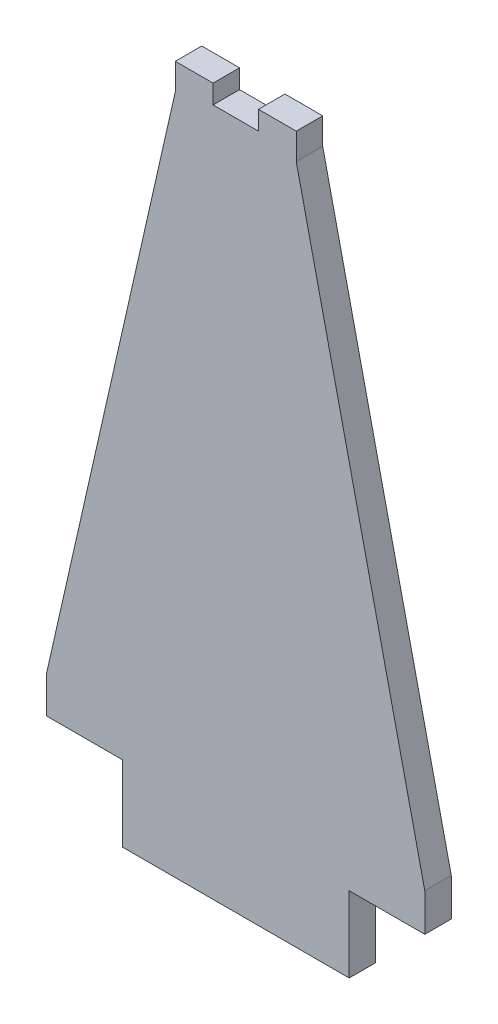
ISO-10303-21;
HEADER;
FILE_DESCRIPTION(('STEP AP214'),'2;1');
FILE_NAME('part.step','',(''),(''),'','','');
FILE_SCHEMA(('AUTOMOTIVE_DESIGN { 1 0 10303 214 1 1 1 1 }'));
ENDSEC;
DATA;
#1=APPLICATION_CONTEXT('core data for automotive mechanical design processes');
#2=APPLICATION_PROTOCOL_DEFINITION('international standard','automotive_design',2000,#1);
#3=PRODUCT_CONTEXT('',#1,'mechanical');
#4=PRODUCT('Part','Part','',(#3));
#5=PRODUCT_RELATED_PRODUCT_CATEGORY('part','',(#4));
#6=PRODUCT_DEFINITION_FORMATION('','',#4);
#7=PRODUCT_DEFINITION_CONTEXT('part definition',#1,'design');
#8=PRODUCT_DEFINITION('design','',#6,#7);
#9=PRODUCT_DEFINITION_SHAPE('','',#8);
#10=(LENGTH_UNIT() NAMED_UNIT(*) SI_UNIT(.MILLI.,.METRE.));
#11=(NAMED_UNIT(*) PLANE_ANGLE_UNIT() SI_UNIT($,.RADIAN.));
#12=(NAMED_UNIT(*) SI_UNIT($,.STERADIAN.) SOLID_ANGLE_UNIT());
#13=UNCERTAINTY_MEASURE_WITH_UNIT(LENGTH_MEASURE(1.E-05),#10,'distance_accuracy_value','');
#14=(GEOMETRIC_REPRESENTATION_CONTEXT(3) GLOBAL_UNCERTAINTY_ASSIGNED_CONTEXT((#13)) GLOBAL_UNIT_ASSIGNED_CONTEXT((#10,
#11,#12)) REPRESENTATION_CONTEXT('',''));
#15=CARTESIAN_POINT('',(0.,0.,0.));
#16=DIRECTION('',(0.,0.,1.));
#17=DIRECTION('',(1.,0.,0.));
#18=AXIS2_PLACEMENT_3D('',#15,#16,#17);
#19=CARTESIAN_POINT('',(0.,1.,0.175));
#20=DIRECTION('',(1.,0.,0.));
#21=DIRECTION('',(0.,1.,0.));
#22=AXIS2_PLACEMENT_3D('',#19,#20,#21);
#23=PLANE('',#22);
#24=DIRECTION('',(0.,-1.,0.));
#25=VECTOR('',#24,1.);
#26=CARTESIAN_POINT('',(0.,1.,-0.175));
#27=LINE('',#26,#25);
#28=CARTESIAN_POINT('',(0.,1.,-0.175));
#29=VERTEX_POINT('',#28);
#30=CARTESIAN_POINT('',(0.,0.,-0.175));
#31=VERTEX_POINT('',#30);
#32=EDGE_CURVE('E177',#29,#31,#27,.T.);
#33=ORIENTED_EDGE('',*,*,#32,.T.);
#34=DIRECTION('',(0.,0.,-1.));
#35=VECTOR('',#34,1.);
#36=CARTESIAN_POINT('',(0.,0.,0.175));
#37=LINE('',#36,#35);
#38=CARTESIAN_POINT('',(0.,0.,0.175));
#39=VERTEX_POINT('',#38);
#40=EDGE_CURVE('E11',#39,#31,#37,.T.);
#41=ORIENTED_EDGE('',*,*,#40,.F.);
#42=DIRECTION('',(0.,-1.,0.));
#43=VECTOR('',#42,1.);
#44=CARTESIAN_POINT('',(0.,1.,0.175));
#45=LINE('',#44,#43);
#46=CARTESIAN_POINT('',(0.,1.,0.175));
#47=VERTEX_POINT('',#46);
#48=EDGE_CURVE('E207',#47,#39,#45,.T.);
#49=ORIENTED_EDGE('',*,*,#48,.F.);
#50=DIRECTION('',(0.,0.,-1.));
#51=VECTOR('',#50,1.);
#52=CARTESIAN_POINT('',(0.,1.,0.175));
#53=LINE('',#52,#51);
#54=EDGE_CURVE('E173',#47,#29,#53,.T.);
#55=ORIENTED_EDGE('',*,*,#54,.T.);
#56=EDGE_LOOP('',(#33,#41,#49,#55));
#57=FACE_BOUND('',#56,.T.);
#58=ADVANCED_FACE('F33',(#57),#23,.F.);
#59=CARTESIAN_POINT('',(0.,0.,0.175));
#60=DIRECTION('',(0.,1.,0.));
#61=DIRECTION('',(-1.,0.,0.));
#62=AXIS2_PLACEMENT_3D('',#59,#60,#61);
#63=PLANE('',#62);
#64=DIRECTION('',(1.,0.,0.));
#65=VECTOR('',#64,1.);
#66=CARTESIAN_POINT('',(0.,0.,-0.175));
#67=LINE('',#66,#65);
#68=CARTESIAN_POINT('',(3.,0.,-0.175));
#69=VERTEX_POINT('',#68);
#70=EDGE_CURVE('E180',#31,#69,#67,.T.);
#71=ORIENTED_EDGE('',*,*,#70,.T.);
#72=DIRECTION('',(0.,0.,-1.));
#73=VECTOR('',#72,1.);
#74=CARTESIAN_POINT('',(3.,0.,0.175));
#75=LINE('',#74,#73);
#76=CARTESIAN_POINT('',(3.,0.,0.175));
#77=VERTEX_POINT('',#76);
#78=EDGE_CURVE('E41',#77,#69,#75,.T.);
#79=ORIENTED_EDGE('',*,*,#78,.F.);
#80=DIRECTION('',(1.,0.,0.));
#81=VECTOR('',#80,1.);
#82=CARTESIAN_POINT('',(0.,0.,0.175));
#83=LINE('',#82,#81);
#84=EDGE_CURVE('E116',#39,#77,#83,.T.);
#85=ORIENTED_EDGE('',*,*,#84,.F.);
#86=ORIENTED_EDGE('',*,*,#40,.T.);
#87=EDGE_LOOP('',(#71,#79,#85,#86));
#88=FACE_BOUND('',#87,.T.);
#89=ADVANCED_FACE('F305',(#88),#63,.F.);
#90=CARTESIAN_POINT('',(3.,0.,0.175));
#91=DIRECTION('',(-1.,0.,0.));
#92=DIRECTION('',(0.,0.,1.));
#93=AXIS2_PLACEMENT_3D('',#90,#91,#92);
#94=PLANE('',#93);
#95=DIRECTION('',(0.,1.,0.));
#96=VECTOR('',#95,1.);
#97=CARTESIAN_POINT('',(3.,0.,-0.175));
#98=LINE('',#97,#96);
#99=CARTESIAN_POINT('',(3.,1.,-0.175));
#100=VERTEX_POINT('',#99);
#101=EDGE_CURVE('E182',#69,#100,#98,.T.);
#102=ORIENTED_EDGE('',*,*,#101,.T.);
#103=DIRECTION('',(0.,0.,-1.));
#104=VECTOR('',#103,1.);
#105=CARTESIAN_POINT('',(3.,1.,0.175));
#106=LINE('',#105,#104);
#107=CARTESIAN_POINT('',(3.,1.,0.175));
#108=VERTEX_POINT('',#107);
#109=EDGE_CURVE('E238',#108,#100,#106,.T.);
#110=ORIENTED_EDGE('',*,*,#109,.F.);
#111=DIRECTION('',(0.,1.,0.));
#112=VECTOR('',#111,1.);
#113=CARTESIAN_POINT('',(3.,0.,0.175));
#114=LINE('',#113,#112);
#115=EDGE_CURVE('E246',#77,#108,#114,.T.);
#116=ORIENTED_EDGE('',*,*,#115,.F.);
#117=ORIENTED_EDGE('',*,*,#78,.T.);
#118=EDGE_LOOP('',(#102,#110,#116,#117));
#119=FACE_BOUND('',#118,.T.);
#120=ADVANCED_FACE('F244',(#119),#94,.F.);
#121=CARTESIAN_POINT('',(3.,1.,0.175));
#122=DIRECTION('',(0.,1.,0.));
#123=DIRECTION('',(-1.,0.,0.));
#124=AXIS2_PLACEMENT_3D('',#121,#122,#123);
#125=PLANE('',#124);
#126=DIRECTION('',(1.,0.,0.));
#127=VECTOR('',#126,1.);
#128=CARTESIAN_POINT('',(3.,1.,-0.175));
#129=LINE('',#128,#127);
#130=CARTESIAN_POINT('',(4.,1.,-0.175));
#131=VERTEX_POINT('',#130);
#132=EDGE_CURVE('E184',#100,#131,#129,.T.);
#133=ORIENTED_EDGE('',*,*,#132,.T.);
#134=DIRECTION('',(0.,0.,-1.));
#135=VECTOR('',#134,1.);
#136=CARTESIAN_POINT('',(4.,1.,0.175));
#137=LINE('',#136,#135);
#138=CARTESIAN_POINT('',(4.,1.,0.175));
#139=VERTEX_POINT('',#138);
#140=EDGE_CURVE('E235',#139,#131,#137,.T.);
#141=ORIENTED_EDGE('',*,*,#140,.F.);
#142=DIRECTION('',(1.,0.,0.));
#143=VECTOR('',#142,1.);
#144=CARTESIAN_POINT('',(3.,1.,0.175));
#145=LINE('',#144,#143);
#146=EDGE_CURVE('E264',#108,#139,#145,.T.);
#147=ORIENTED_EDGE('',*,*,#146,.F.);
#148=ORIENTED_EDGE('',*,*,#109,.T.);
#149=EDGE_LOOP('',(#133,#141,#147,#148));
#150=FACE_BOUND('',#149,.T.);
#151=ADVANCED_FACE('F255',(#150),#125,.F.);
#152=CARTESIAN_POINT('',(4.,1.,0.175));
#153=DIRECTION('',(-1.,0.,0.));
#154=DIRECTION('',(0.,0.,1.));
#155=AXIS2_PLACEMENT_3D('',#152,#153,#154);
#156=PLANE('',#155);
#157=DIRECTION('',(0.,1.,0.));
#158=VECTOR('',#157,1.);
#159=CARTESIAN_POINT('',(4.,1.,-0.175));
#160=LINE('',#159,#158);
#161=CARTESIAN_POINT('',(4.,1.5,-0.175));
#162=VERTEX_POINT('',#161);
#163=EDGE_CURVE('E186',#131,#162,#160,.T.);
#164=ORIENTED_EDGE('',*,*,#163,.T.);
#165=DIRECTION('',(0.,0.,-1.));
#166=VECTOR('',#165,1.);
#167=CARTESIAN_POINT('',(4.,1.5,0.175));
#168=LINE('',#167,#166);
#169=CARTESIAN_POINT('',(4.,1.5,0.175));
#170=VERTEX_POINT('',#169);
#171=EDGE_CURVE('E232',#170,#162,#168,.T.);
#172=ORIENTED_EDGE('',*,*,#171,.F.);
#173=DIRECTION('',(0.,1.,0.));
#174=VECTOR('',#173,1.);
#175=CARTESIAN_POINT('',(4.,1.,0.175));
#176=LINE('',#175,#174);
#177=EDGE_CURVE('E261',#139,#170,#176,.T.);
#178=ORIENTED_EDGE('',*,*,#177,.F.);
#179=ORIENTED_EDGE('',*,*,#140,.T.);
#180=EDGE_LOOP('',(#164,#172,#178,#179));
#181=FACE_BOUND('',#180,.T.);
#182=ADVANCED_FACE('F259',(#181),#156,.F.);
#183=CARTESIAN_POINT('',(4.,1.5,0.175));
#184=DIRECTION('',(-0.97526042930658,-0.221059030642825,0.));
#185=DIRECTION('',(0.221059030642825,-0.97526042930658,0.));
#186=AXIS2_PLACEMENT_3D('',#183,#184,#185);
#187=PLANE('',#186);
#188=DIRECTION('',(-0.221059030642825,0.97526042930658,0.));
#189=VECTOR('',#188,1.);
#190=CARTESIAN_POINT('',(4.,1.5,-0.175));
#191=LINE('',#190,#189);
#192=CARTESIAN_POINT('',(2.3,9.,-0.175));
#193=VERTEX_POINT('',#192);
#194=EDGE_CURVE('E188',#162,#193,#191,.T.);
#195=ORIENTED_EDGE('',*,*,#194,.T.);
#196=DIRECTION('',(0.,0.,-1.));
#197=VECTOR('',#196,1.);
#198=CARTESIAN_POINT('',(2.3,9.,0.175));
#199=LINE('',#198,#197);
#200=CARTESIAN_POINT('',(2.3,9.,0.175));
#201=VERTEX_POINT('',#200);
#202=EDGE_CURVE('E229',#201,#193,#199,.T.);
#203=ORIENTED_EDGE('',*,*,#202,.F.);
#204=DIRECTION('',(-0.221059030642825,0.97526042930658,0.));
#205=VECTOR('',#204,1.);
#206=CARTESIAN_POINT('',(4.,1.5,0.175));
#207=LINE('',#206,#205);
#208=EDGE_CURVE('E263',#170,#201,#207,.T.);
#209=ORIENTED_EDGE('',*,*,#208,.F.);
#210=ORIENTED_EDGE('',*,*,#171,.T.);
#211=EDGE_LOOP('',(#195,#203,#209,#210));
#212=FACE_BOUND('',#211,.T.);
#213=ADVANCED_FACE('F318',(#212),#187,.F.);
#214=CARTESIAN_POINT('',(2.3,9.,0.175));
#215=DIRECTION('',(-1.,0.,0.));
#216=DIRECTION('',(0.,0.,1.));
#217=AXIS2_PLACEMENT_3D('',#214,#215,#216);
#218=PLANE('',#217);
#219=DIRECTION('',(0.,1.,0.));
#220=VECTOR('',#219,1.);
#221=CARTESIAN_POINT('',(2.3,9.,-0.175));
#222=LINE('',#221,#220);
#223=CARTESIAN_POINT('',(2.3,9.35,-0.175));
#224=VERTEX_POINT('',#223);
#225=EDGE_CURVE('E190',#193,#224,#222,.T.);
#226=ORIENTED_EDGE('',*,*,#225,.T.);
#227=DIRECTION('',(0.,0.,-1.));
#228=VECTOR('',#227,1.);
#229=CARTESIAN_POINT('',(2.3,9.35,0.175));
#230=LINE('',#229,#228);
#231=CARTESIAN_POINT('',(2.3,9.35,0.175));
#232=VERTEX_POINT('',#231);
#233=EDGE_CURVE('E226',#232,#224,#230,.T.);
#234=ORIENTED_EDGE('',*,*,#233,.F.);
#235=DIRECTION('',(0.,1.,0.));
#236=VECTOR('',#235,1.);
#237=CARTESIAN_POINT('',(2.3,9.,0.175));
#238=LINE('',#237,#236);
#239=EDGE_CURVE('E266',#201,#232,#238,.T.);
#240=ORIENTED_EDGE('',*,*,#239,.F.);
#241=ORIENTED_EDGE('',*,*,#202,.T.);
#242=EDGE_LOOP('',(#226,#234,#240,#241));
#243=FACE_BOUND('',#242,.T.);
#244=ADVANCED_FACE('F321',(#243),#218,.F.);
#245=CARTESIAN_POINT('',(2.3,9.35,0.175));
#246=DIRECTION('',(0.,-1.,0.));
#247=DIRECTION('',(0.,0.,-1.));
#248=AXIS2_PLACEMENT_3D('',#245,#246,#247);
#249=PLANE('',#248);
#250=DIRECTION('',(-1.,0.,0.));
#251=VECTOR('',#250,1.);
#252=CARTESIAN_POINT('',(2.3,9.35,-0.175));
#253=LINE('',#252,#251);
#254=CARTESIAN_POINT('',(1.8,9.35,-0.175));
#255=VERTEX_POINT('',#254);
#256=EDGE_CURVE('E192',#224,#255,#253,.T.);
#257=ORIENTED_EDGE('',*,*,#256,.T.);
#258=DIRECTION('',(0.,0.,-1.));
#259=VECTOR('',#258,1.);
#260=CARTESIAN_POINT('',(1.8,9.35,0.175));
#261=LINE('',#260,#259);
#262=CARTESIAN_POINT('',(1.8,9.35,0.175));
#263=VERTEX_POINT('',#262);
#264=EDGE_CURVE('E223',#263,#255,#261,.T.);
#265=ORIENTED_EDGE('',*,*,#264,.F.);
#266=DIRECTION('',(-1.,0.,0.));
#267=VECTOR('',#266,1.);
#268=CARTESIAN_POINT('',(2.3,9.35,0.175));
#269=LINE('',#268,#267);
#270=EDGE_CURVE('E272',#232,#263,#269,.T.);
#271=ORIENTED_EDGE('',*,*,#270,.F.);
#272=ORIENTED_EDGE('',*,*,#233,.T.);
#273=EDGE_LOOP('',(#257,#265,#271,#272));
#274=FACE_BOUND('',#273,.T.);
#275=ADVANCED_FACE('F325',(#274),#249,.F.);
#276=CARTESIAN_POINT('',(1.8,9.35,0.175));
#277=DIRECTION('',(1.,0.,0.));
#278=DIRECTION('',(0.,1.,0.));
#279=AXIS2_PLACEMENT_3D('',#276,#277,#278);
#280=PLANE('',#279);
#281=DIRECTION('',(0.,-1.,0.));
#282=VECTOR('',#281,1.);
#283=CARTESIAN_POINT('',(1.8,9.35,-0.175));
#284=LINE('',#283,#282);
#285=CARTESIAN_POINT('',(1.8,9.1,-0.175));
#286=VERTEX_POINT('',#285);
#287=EDGE_CURVE('E194',#255,#286,#284,.T.);
#288=ORIENTED_EDGE('',*,*,#287,.T.);
#289=DIRECTION('',(0.,0.,-1.));
#290=VECTOR('',#289,1.);
#291=CARTESIAN_POINT('',(1.8,9.1,0.175));
#292=LINE('',#291,#290);
#293=CARTESIAN_POINT('',(1.8,9.1,0.175));
#294=VERTEX_POINT('',#293);
#295=EDGE_CURVE('E220',#294,#286,#292,.T.);
#296=ORIENTED_EDGE('',*,*,#295,.F.);
#297=DIRECTION('',(0.,-1.,0.));
#298=VECTOR('',#297,1.);
#299=CARTESIAN_POINT('',(1.8,9.35,0.175));
#300=LINE('',#299,#298);
#301=EDGE_CURVE('E274',#263,#294,#300,.T.);
#302=ORIENTED_EDGE('',*,*,#301,.F.);
#303=ORIENTED_EDGE('',*,*,#264,.T.);
#304=EDGE_LOOP('',(#288,#296,#302,#303));
#305=FACE_BOUND('',#304,.T.);
#306=ADVANCED_FACE('F329',(#305),#280,.F.);
#307=CARTESIAN_POINT('',(1.8,9.1,0.175));
#308=DIRECTION('',(0.,-1.,0.));
#309=DIRECTION('',(0.,0.,-1.));
#310=AXIS2_PLACEMENT_3D('',#307,#308,#309);
#311=PLANE('',#310);
#312=DIRECTION('',(-1.,0.,0.));
#313=VECTOR('',#312,1.);
#314=CARTESIAN_POINT('',(1.8,9.1,-0.175));
#315=LINE('',#314,#313);
#316=CARTESIAN_POINT('',(1.2,9.1,-0.175));
#317=VERTEX_POINT('',#316);
#318=EDGE_CURVE('E196',#286,#317,#315,.T.);
#319=ORIENTED_EDGE('',*,*,#318,.T.);
#320=DIRECTION('',(0.,0.,-1.));
#321=VECTOR('',#320,1.);
#322=CARTESIAN_POINT('',(1.2,9.1,0.175));
#323=LINE('',#322,#321);
#324=CARTESIAN_POINT('',(1.2,9.1,0.175));
#325=VERTEX_POINT('',#324);
#326=EDGE_CURVE('E217',#325,#317,#323,.T.);
#327=ORIENTED_EDGE('',*,*,#326,.F.);
#328=DIRECTION('',(-1.,0.,0.));
#329=VECTOR('',#328,1.);
#330=CARTESIAN_POINT('',(1.8,9.1,0.175));
#331=LINE('',#330,#329);
#332=EDGE_CURVE('E276',#294,#325,#331,.T.);
#333=ORIENTED_EDGE('',*,*,#332,.F.);
#334=ORIENTED_EDGE('',*,*,#295,.T.);
#335=EDGE_LOOP('',(#319,#327,#333,#334));
#336=FACE_BOUND('',#335,.T.);
#337=ADVANCED_FACE('F333',(#336),#311,.F.);
#338=CARTESIAN_POINT('',(1.2,9.1,0.175));
#339=DIRECTION('',(-1.,0.,0.));
#340=DIRECTION('',(0.,0.,1.));
#341=AXIS2_PLACEMENT_3D('',#338,#339,#340);
#342=PLANE('',#341);
#343=DIRECTION('',(0.,1.,0.));
#344=VECTOR('',#343,1.);
#345=CARTESIAN_POINT('',(1.2,9.1,-0.175));
#346=LINE('',#345,#344);
#347=CARTESIAN_POINT('',(1.2,9.35,-0.175));
#348=VERTEX_POINT('',#347);
#349=EDGE_CURVE('E198',#317,#348,#346,.T.);
#350=ORIENTED_EDGE('',*,*,#349,.T.);
#351=DIRECTION('',(0.,0.,-1.));
#352=VECTOR('',#351,1.);
#353=CARTESIAN_POINT('',(1.2,9.35,0.175));
#354=LINE('',#353,#352);
#355=CARTESIAN_POINT('',(1.2,9.35,0.175));
#356=VERTEX_POINT('',#355);
#357=EDGE_CURVE('E214',#356,#348,#354,.T.);
#358=ORIENTED_EDGE('',*,*,#357,.F.);
#359=DIRECTION('',(0.,1.,0.));
#360=VECTOR('',#359,1.);
#361=CARTESIAN_POINT('',(1.2,9.1,0.175));
#362=LINE('',#361,#360);
#363=EDGE_CURVE('E278',#325,#356,#362,.T.);
#364=ORIENTED_EDGE('',*,*,#363,.F.);
#365=ORIENTED_EDGE('',*,*,#326,.T.);
#366=EDGE_LOOP('',(#350,#358,#364,#365));
#367=FACE_BOUND('',#366,.T.);
#368=ADVANCED_FACE('F337',(#367),#342,.F.);
#369=CARTESIAN_POINT('',(1.2,9.35,0.175));
#370=DIRECTION('',(0.,-1.,0.));
#371=DIRECTION('',(0.,0.,-1.));
#372=AXIS2_PLACEMENT_3D('',#369,#370,#371);
#373=PLANE('',#372);
#374=DIRECTION('',(-1.,0.,0.));
#375=VECTOR('',#374,1.);
#376=CARTESIAN_POINT('',(1.2,9.35,-0.175));
#377=LINE('',#376,#375);
#378=CARTESIAN_POINT('',(0.699999999999999,9.35,-0.175));
#379=VERTEX_POINT('',#378);
#380=EDGE_CURVE('E200',#348,#379,#377,.T.);
#381=ORIENTED_EDGE('',*,*,#380,.T.);
#382=DIRECTION('',(0.,0.,-1.));
#383=VECTOR('',#382,1.);
#384=CARTESIAN_POINT('',(0.699999999999999,9.35,0.175));
#385=LINE('',#384,#383);
#386=CARTESIAN_POINT('',(0.699999999999999,9.35,0.175));
#387=VERTEX_POINT('',#386);
#388=EDGE_CURVE('E211',#387,#379,#385,.T.);
#389=ORIENTED_EDGE('',*,*,#388,.F.);
#390=DIRECTION('',(-1.,0.,0.));
#391=VECTOR('',#390,1.);
#392=CARTESIAN_POINT('',(1.2,9.35,0.175));
#393=LINE('',#392,#391);
#394=EDGE_CURVE('E280',#356,#387,#393,.T.);
#395=ORIENTED_EDGE('',*,*,#394,.F.);
#396=ORIENTED_EDGE('',*,*,#357,.T.);
#397=EDGE_LOOP('',(#381,#389,#395,#396));
#398=FACE_BOUND('',#397,.T.);
#399=ADVANCED_FACE('F286',(#398),#373,.F.);
#400=CARTESIAN_POINT('',(0.699999999999999,9.35,0.175));
#401=DIRECTION('',(1.,0.,0.));
#402=DIRECTION('',(0.,0.,-1.));
#403=AXIS2_PLACEMENT_3D('',#400,#401,#402);
#404=PLANE('',#403);
#405=DIRECTION('',(0.,-1.,0.));
#406=VECTOR('',#405,1.);
#407=CARTESIAN_POINT('',(0.699999999999999,9.35,-0.175));
#408=LINE('',#407,#406);
#409=CARTESIAN_POINT('',(0.699999999999999,9.,-0.175));
#410=VERTEX_POINT('',#409);
#411=EDGE_CURVE('E202',#379,#410,#408,.T.);
#412=ORIENTED_EDGE('',*,*,#411,.T.);
#413=DIRECTION('',(0.,0.,-1.));
#414=VECTOR('',#413,1.);
#415=CARTESIAN_POINT('',(0.699999999999999,9.,0.175));
#416=LINE('',#415,#414);
#417=CARTESIAN_POINT('',(0.699999999999999,9.,0.175));
#418=VERTEX_POINT('',#417);
#419=EDGE_CURVE('E168',#418,#410,#416,.T.);
#420=ORIENTED_EDGE('',*,*,#419,.F.);
#421=DIRECTION('',(0.,-1.,0.));
#422=VECTOR('',#421,1.);
#423=CARTESIAN_POINT('',(0.699999999999999,9.35,0.175));
#424=LINE('',#423,#422);
#425=EDGE_CURVE('E159',#387,#418,#424,.T.);
#426=ORIENTED_EDGE('',*,*,#425,.F.);
#427=ORIENTED_EDGE('',*,*,#388,.T.);
#428=EDGE_LOOP('',(#412,#420,#426,#427));
#429=FACE_BOUND('',#428,.T.);
#430=ADVANCED_FACE('F290',(#429),#404,.F.);
#431=CARTESIAN_POINT('',(0.699999999999999,9.,0.175));
#432=DIRECTION('',(0.97526042930658,-0.221059030642825,0.));
#433=DIRECTION('',(0.221059030642825,0.97526042930658,0.));
#434=AXIS2_PLACEMENT_3D('',#431,#432,#433);
#435=PLANE('',#434);
#436=DIRECTION('',(-0.221059030642825,-0.97526042930658,0.));
#437=VECTOR('',#436,1.);
#438=CARTESIAN_POINT('',(0.699999999999999,9.,-0.175));
#439=LINE('',#438,#437);
#440=CARTESIAN_POINT('',(-1.,1.5,-0.175));
#441=VERTEX_POINT('',#440);
#442=EDGE_CURVE('E167',#410,#441,#439,.T.);
#443=ORIENTED_EDGE('',*,*,#442,.T.);
#444=DIRECTION('',(0.,0.,-1.));
#445=VECTOR('',#444,1.);
#446=CARTESIAN_POINT('',(-1.,1.5,0.175));
#447=LINE('',#446,#445);
#448=CARTESIAN_POINT('',(-1.,1.5,0.175));
#449=VERTEX_POINT('',#448);
#450=EDGE_CURVE('E164',#449,#441,#447,.T.);
#451=ORIENTED_EDGE('',*,*,#450,.F.);
#452=DIRECTION('',(-0.221059030642825,-0.97526042930658,0.));
#453=VECTOR('',#452,1.);
#454=CARTESIAN_POINT('',(0.699999999999999,9.,0.175));
#455=LINE('',#454,#453);
#456=EDGE_CURVE('E153',#418,#449,#455,.T.);
#457=ORIENTED_EDGE('',*,*,#456,.F.);
#458=ORIENTED_EDGE('',*,*,#419,.T.);
#459=EDGE_LOOP('',(#443,#451,#457,#458));
#460=FACE_BOUND('',#459,.T.);
#461=ADVANCED_FACE('F165',(#460),#435,.F.);
#462=CARTESIAN_POINT('',(-1.,1.5,0.175));
#463=DIRECTION('',(1.,0.,0.));
#464=DIRECTION('',(0.,0.,-1.));
#465=AXIS2_PLACEMENT_3D('',#462,#463,#464);
#466=PLANE('',#465);
#467=DIRECTION('',(0.,-1.,0.));
#468=VECTOR('',#467,1.);
#469=CARTESIAN_POINT('',(-1.,1.5,-0.175));
#470=LINE('',#469,#468);
#471=CARTESIAN_POINT('',(-1.,1.,-0.175));
#472=VERTEX_POINT('',#471);
#473=EDGE_CURVE('E102',#441,#472,#470,.T.);
#474=ORIENTED_EDGE('',*,*,#473,.T.);
#475=DIRECTION('',(0.,0.,-1.));
#476=VECTOR('',#475,1.);
#477=CARTESIAN_POINT('',(-1.,1.,0.175));
#478=LINE('',#477,#476);
#479=CARTESIAN_POINT('',(-1.,1.,0.175));
#480=VERTEX_POINT('',#479);
#481=EDGE_CURVE('E169',#480,#472,#478,.T.);
#482=ORIENTED_EDGE('',*,*,#481,.F.);
#483=DIRECTION('',(0.,-1.,0.));
#484=VECTOR('',#483,1.);
#485=CARTESIAN_POINT('',(-1.,1.5,0.175));
#486=LINE('',#485,#484);
#487=EDGE_CURVE('E157',#449,#480,#486,.T.);
#488=ORIENTED_EDGE('',*,*,#487,.F.);
#489=ORIENTED_EDGE('',*,*,#450,.T.);
#490=EDGE_LOOP('',(#474,#482,#488,#489));
#491=FACE_BOUND('',#490,.T.);
#492=ADVANCED_FACE('F171',(#491),#466,.F.);
#493=CARTESIAN_POINT('',(-1.,1.,0.175));
#494=DIRECTION('',(0.,1.,0.));
#495=DIRECTION('',(-1.,0.,0.));
#496=AXIS2_PLACEMENT_3D('',#493,#494,#495);
#497=PLANE('',#496);
#498=DIRECTION('',(1.,0.,0.));
#499=VECTOR('',#498,1.);
#500=CARTESIAN_POINT('',(-1.,1.,-0.175));
#501=LINE('',#500,#499);
#502=EDGE_CURVE('E108',#472,#29,#501,.T.);
#503=ORIENTED_EDGE('',*,*,#502,.T.);
#504=ORIENTED_EDGE('',*,*,#54,.F.);
#505=DIRECTION('',(1.,0.,0.));
#506=VECTOR('',#505,1.);
#507=CARTESIAN_POINT('',(-1.,1.,0.175));
#508=LINE('',#507,#506);
#509=EDGE_CURVE('E49',#480,#47,#508,.T.);
#510=ORIENTED_EDGE('',*,*,#509,.F.);
#511=ORIENTED_EDGE('',*,*,#481,.T.);
#512=EDGE_LOOP('',(#503,#504,#510,#511));
#513=FACE_BOUND('',#512,.T.);
#514=ADVANCED_FACE('F294',(#513),#497,.F.);
#515=CARTESIAN_POINT('',(0.,0.,0.175));
#516=DIRECTION('',(0.,0.,1.));
#517=DIRECTION('',(1.,0.,0.));
#518=AXIS2_PLACEMENT_3D('',#515,#516,#517);
#519=PLANE('',#518);
#520=ORIENTED_EDGE('',*,*,#48,.T.);
#521=ORIENTED_EDGE('',*,*,#84,.T.);
#522=ORIENTED_EDGE('',*,*,#115,.T.);
#523=ORIENTED_EDGE('',*,*,#146,.T.);
#524=ORIENTED_EDGE('',*,*,#177,.T.);
#525=ORIENTED_EDGE('',*,*,#208,.T.);
#526=ORIENTED_EDGE('',*,*,#239,.T.);
#527=ORIENTED_EDGE('',*,*,#270,.T.);
#528=ORIENTED_EDGE('',*,*,#301,.T.);
#529=ORIENTED_EDGE('',*,*,#332,.T.);
#530=ORIENTED_EDGE('',*,*,#363,.T.);
#531=ORIENTED_EDGE('',*,*,#394,.T.);
#532=ORIENTED_EDGE('',*,*,#425,.T.);
#533=ORIENTED_EDGE('',*,*,#456,.T.);
#534=ORIENTED_EDGE('',*,*,#487,.T.);
#535=ORIENTED_EDGE('',*,*,#509,.T.);
#536=EDGE_LOOP('',(#520,#521,#522,#523,#524,#525,#526,#527,#528,#529,#530,#531,#532,#533,#534,#535));
#537=FACE_BOUND('',#536,.T.);
#538=ADVANCED_FACE('F155',(#537),#519,.T.);
#539=CARTESIAN_POINT('',(0.,0.,-0.175));
#540=DIRECTION('',(0.,0.,1.));
#541=DIRECTION('',(1.,0.,0.));
#542=AXIS2_PLACEMENT_3D('',#539,#540,#541);
#543=PLANE('',#542);
#544=ORIENTED_EDGE('',*,*,#32,.F.);
#545=ORIENTED_EDGE('',*,*,#502,.F.);
#546=ORIENTED_EDGE('',*,*,#473,.F.);
#547=ORIENTED_EDGE('',*,*,#442,.F.);
#548=ORIENTED_EDGE('',*,*,#411,.F.);
#549=ORIENTED_EDGE('',*,*,#380,.F.);
#550=ORIENTED_EDGE('',*,*,#349,.F.);
#551=ORIENTED_EDGE('',*,*,#318,.F.);
#552=ORIENTED_EDGE('',*,*,#287,.F.);
#553=ORIENTED_EDGE('',*,*,#256,.F.);
#554=ORIENTED_EDGE('',*,*,#225,.F.);
#555=ORIENTED_EDGE('',*,*,#194,.F.);
#556=ORIENTED_EDGE('',*,*,#163,.F.);
#557=ORIENTED_EDGE('',*,*,#132,.F.);
#558=ORIENTED_EDGE('',*,*,#101,.F.);
#559=ORIENTED_EDGE('',*,*,#70,.F.);
#560=EDGE_LOOP('',(#544,#545,#546,#547,#548,#549,#550,#551,#552,#553,#554,#555,#556,#557,#558,#559));
#561=FACE_BOUND('',#560,.T.);
#562=ADVANCED_FACE('F250',(#561),#543,.F.);
#563=CLOSED_SHELL('',(#58,#89,#120,#151,#182,#213,#244,#275,#306,#337,#368,#399,#430,#461,#492,
#514,#538,#562));
#564=MANIFOLD_SOLID_BREP('B2',#563);
#565=ADVANCED_BREP_SHAPE_REPRESENTATION('',(#18,#564),#14);
#566=SHAPE_DEFINITION_REPRESENTATION(#9,#565);
ENDSEC;
END-ISO-10303-21;
